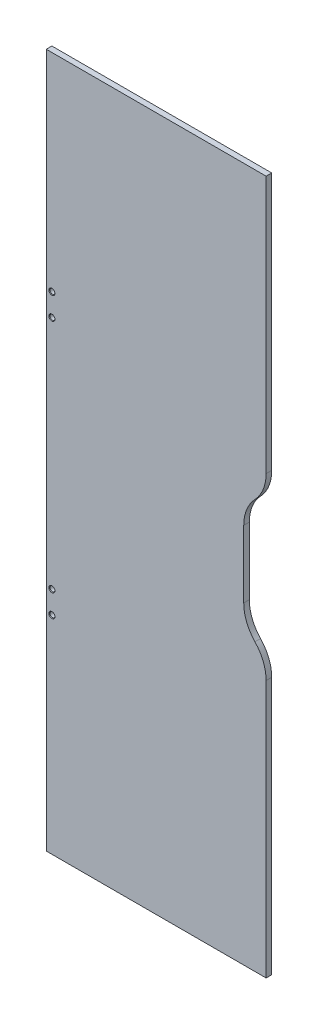
ISO-10303-21;
HEADER;
FILE_DESCRIPTION(('STEP AP214'),'2;1');
FILE_NAME('part.step','',(''),(''),'','','');
FILE_SCHEMA(('AUTOMOTIVE_DESIGN { 1 0 10303 214 1 1 1 1 }'));
ENDSEC;
DATA;
#1=APPLICATION_CONTEXT('core data for automotive mechanical design processes');
#2=APPLICATION_PROTOCOL_DEFINITION('international standard','automotive_design',2000,#1);
#3=PRODUCT_CONTEXT('',#1,'mechanical');
#4=PRODUCT('Part','Part','',(#3));
#5=PRODUCT_RELATED_PRODUCT_CATEGORY('part','',(#4));
#6=PRODUCT_DEFINITION_FORMATION('','',#4);
#7=PRODUCT_DEFINITION_CONTEXT('part definition',#1,'design');
#8=PRODUCT_DEFINITION('design','',#6,#7);
#9=PRODUCT_DEFINITION_SHAPE('','',#8);
#10=(LENGTH_UNIT() NAMED_UNIT(*) SI_UNIT(.MILLI.,.METRE.));
#11=(NAMED_UNIT(*) PLANE_ANGLE_UNIT() SI_UNIT($,.RADIAN.));
#12=(NAMED_UNIT(*) SI_UNIT($,.STERADIAN.) SOLID_ANGLE_UNIT());
#13=UNCERTAINTY_MEASURE_WITH_UNIT(LENGTH_MEASURE(1.E-05),#10,'distance_accuracy_value','');
#14=(GEOMETRIC_REPRESENTATION_CONTEXT(3) GLOBAL_UNCERTAINTY_ASSIGNED_CONTEXT((#13)) GLOBAL_UNIT_ASSIGNED_CONTEXT((#10,
#11,#12)) REPRESENTATION_CONTEXT('',''));
#15=CARTESIAN_POINT('',(0.,0.,0.));
#16=DIRECTION('',(0.,0.,1.));
#17=DIRECTION('',(1.,0.,0.));
#18=AXIS2_PLACEMENT_3D('',#15,#16,#17);
#19=CARTESIAN_POINT('',(292.1,0.,6.35));
#20=DIRECTION('',(-1.,0.,0.));
#21=DIRECTION('',(0.,0.,1.));
#22=AXIS2_PLACEMENT_3D('',#19,#20,#21);
#23=PLANE('',#22);
#24=DIRECTION('',(0.,0.,1.));
#25=VECTOR('',#24,1.);
#26=CARTESIAN_POINT('',(292.1,292.1,0.));
#27=LINE('',#26,#25);
#28=CARTESIAN_POINT('',(292.1,292.1,0.));
#29=VERTEX_POINT('',#28);
#30=CARTESIAN_POINT('',(292.1,292.1,6.35));
#31=VERTEX_POINT('',#30);
#32=EDGE_CURVE('E169',#29,#31,#27,.T.);
#33=ORIENTED_EDGE('',*,*,#32,.T.);
#34=DIRECTION('',(0.,1.,0.));
#35=VECTOR('',#34,1.);
#36=CARTESIAN_POINT('',(292.1,0.,6.35));
#37=LINE('',#36,#35);
#38=CARTESIAN_POINT('',(292.1,0.,6.35));
#39=VERTEX_POINT('',#38);
#40=EDGE_CURVE('E217',#39,#31,#37,.T.);
#41=ORIENTED_EDGE('',*,*,#40,.F.);
#42=DIRECTION('',(0.,0.,-1.));
#43=VECTOR('',#42,1.);
#44=CARTESIAN_POINT('',(292.1,0.,6.35));
#45=LINE('',#44,#43);
#46=CARTESIAN_POINT('',(292.1,0.,0.));
#47=VERTEX_POINT('',#46);
#48=EDGE_CURVE('E47',#39,#47,#45,.T.);
#49=ORIENTED_EDGE('',*,*,#48,.T.);
#50=DIRECTION('',(0.,1.,0.));
#51=VECTOR('',#50,1.);
#52=CARTESIAN_POINT('',(292.1,0.,0.));
#53=LINE('',#52,#51);
#54=EDGE_CURVE('E226',#47,#29,#53,.T.);
#55=ORIENTED_EDGE('',*,*,#54,.T.);
#56=EDGE_LOOP('',(#33,#41,#49,#55));
#57=FACE_BOUND('',#56,.T.);
#58=ADVANCED_FACE('F39',(#57),#23,.F.);
#59=CARTESIAN_POINT('',(42.799,0.,6.35));
#60=DIRECTION('',(1.,0.,0.));
#61=DIRECTION('',(0.,0.,-1.));
#62=AXIS2_PLACEMENT_3D('',#59,#60,#61);
#63=PLANE('',#62);
#64=DIRECTION('',(0.,-1.,0.));
#65=VECTOR('',#64,1.);
#66=CARTESIAN_POINT('',(42.799,0.,0.));
#67=LINE('',#66,#65);
#68=CARTESIAN_POINT('',(42.799,787.4,0.));
#69=VERTEX_POINT('',#68);
#70=CARTESIAN_POINT('',(42.799,0.,0.));
#71=VERTEX_POINT('',#70);
#72=EDGE_CURVE('E212',#69,#71,#67,.T.);
#73=ORIENTED_EDGE('',*,*,#72,.T.);
#74=DIRECTION('',(0.,0.,-1.));
#75=VECTOR('',#74,1.);
#76=CARTESIAN_POINT('',(42.799,0.,6.35));
#77=LINE('',#76,#75);
#78=CARTESIAN_POINT('',(42.799,0.,6.35));
#79=VERTEX_POINT('',#78);
#80=EDGE_CURVE('E11',#79,#71,#77,.T.);
#81=ORIENTED_EDGE('',*,*,#80,.F.);
#82=DIRECTION('',(0.,-1.,0.));
#83=VECTOR('',#82,1.);
#84=CARTESIAN_POINT('',(42.799,0.,6.35));
#85=LINE('',#84,#83);
#86=CARTESIAN_POINT('',(42.799,787.4,6.35));
#87=VERTEX_POINT('',#86);
#88=EDGE_CURVE('E213',#87,#79,#85,.T.);
#89=ORIENTED_EDGE('',*,*,#88,.F.);
#90=DIRECTION('',(0.,0.,-1.));
#91=VECTOR('',#90,1.);
#92=CARTESIAN_POINT('',(42.799,787.4,6.35));
#93=LINE('',#92,#91);
#94=EDGE_CURVE('E221',#87,#69,#93,.T.);
#95=ORIENTED_EDGE('',*,*,#94,.T.);
#96=EDGE_LOOP('',(#73,#81,#89,#95));
#97=FACE_BOUND('',#96,.T.);
#98=ADVANCED_FACE('F41',(#97),#63,.F.);
#99=CARTESIAN_POINT('',(42.799,0.,6.35));
#100=DIRECTION('',(0.,1.,0.));
#101=DIRECTION('',(0.,0.,1.));
#102=AXIS2_PLACEMENT_3D('',#99,#100,#101);
#103=PLANE('',#102);
#104=DIRECTION('',(1.,0.,0.));
#105=VECTOR('',#104,1.);
#106=CARTESIAN_POINT('',(42.799,0.,0.));
#107=LINE('',#106,#105);
#108=EDGE_CURVE('E224',#71,#47,#107,.T.);
#109=ORIENTED_EDGE('',*,*,#108,.T.);
#110=ORIENTED_EDGE('',*,*,#48,.F.);
#111=DIRECTION('',(1.,0.,0.));
#112=VECTOR('',#111,1.);
#113=CARTESIAN_POINT('',(42.799,0.,6.35));
#114=LINE('',#113,#112);
#115=EDGE_CURVE('E91',#79,#39,#114,.T.);
#116=ORIENTED_EDGE('',*,*,#115,.F.);
#117=ORIENTED_EDGE('',*,*,#80,.T.);
#118=EDGE_LOOP('',(#109,#110,#116,#117));
#119=FACE_BOUND('',#118,.T.);
#120=ADVANCED_FACE('F247',(#119),#103,.F.);
#121=CARTESIAN_POINT('',(292.1,495.3,6.35));
#122=VERTEX_POINT('',#121);
#123=CARTESIAN_POINT('',(292.1,787.4,6.35));
#124=VERTEX_POINT('',#123);
#125=EDGE_CURVE('E216',#122,#124,#37,.T.);
#126=ORIENTED_EDGE('',*,*,#125,.F.);
#127=DIRECTION('',(0.,0.,1.));
#128=VECTOR('',#127,1.);
#129=CARTESIAN_POINT('',(292.1,495.3,0.));
#130=LINE('',#129,#128);
#131=CARTESIAN_POINT('',(292.1,495.3,0.));
#132=VERTEX_POINT('',#131);
#133=EDGE_CURVE('E166',#132,#122,#130,.T.);
#134=ORIENTED_EDGE('',*,*,#133,.F.);
#135=CARTESIAN_POINT('',(292.1,787.4,0.));
#136=VERTEX_POINT('',#135);
#137=EDGE_CURVE('E146',#132,#136,#53,.T.);
#138=ORIENTED_EDGE('',*,*,#137,.T.);
#139=DIRECTION('',(0.,0.,-1.));
#140=VECTOR('',#139,1.);
#141=CARTESIAN_POINT('',(292.1,787.4,6.35));
#142=LINE('',#141,#140);
#143=EDGE_CURVE('E231',#124,#136,#142,.T.);
#144=ORIENTED_EDGE('',*,*,#143,.F.);
#145=EDGE_LOOP('',(#126,#134,#138,#144));
#146=FACE_BOUND('',#145,.T.);
#147=ADVANCED_FACE('F249',(#146),#23,.F.);
#148=CARTESIAN_POINT('',(42.799,787.4,6.35));
#149=DIRECTION('',(0.,-1.,0.));
#150=DIRECTION('',(0.,0.,-1.));
#151=AXIS2_PLACEMENT_3D('',#148,#149,#150);
#152=PLANE('',#151);
#153=DIRECTION('',(-1.,0.,0.));
#154=VECTOR('',#153,1.);
#155=CARTESIAN_POINT('',(42.799,787.4,0.));
#156=LINE('',#155,#154);
#157=EDGE_CURVE('E84',#136,#69,#156,.T.);
#158=ORIENTED_EDGE('',*,*,#157,.T.);
#159=ORIENTED_EDGE('',*,*,#94,.F.);
#160=DIRECTION('',(-1.,0.,0.));
#161=VECTOR('',#160,1.);
#162=CARTESIAN_POINT('',(42.799,787.4,6.35));
#163=LINE('',#162,#161);
#164=EDGE_CURVE('E63',#124,#87,#163,.T.);
#165=ORIENTED_EDGE('',*,*,#164,.F.);
#166=ORIENTED_EDGE('',*,*,#143,.T.);
#167=EDGE_LOOP('',(#158,#159,#165,#166));
#168=FACE_BOUND('',#167,.T.);
#169=ADVANCED_FACE('F255',(#168),#152,.F.);
#170=CARTESIAN_POINT('',(0.,0.,6.35));
#171=DIRECTION('',(0.,0.,-1.));
#172=DIRECTION('',(-1.,0.,0.));
#173=AXIS2_PLACEMENT_3D('',#170,#171,#172);
#174=PLANE('',#173);
#175=CARTESIAN_POINT('',(49.149,552.45,6.35));
#176=DIRECTION('',(0.,0.,1.));
#177=DIRECTION('',(1.,0.,0.));
#178=AXIS2_PLACEMENT_3D('',#175,#176,#177);
#179=CIRCLE('',#178,3.4417);
#180=CARTESIAN_POINT('',(52.5907,552.45,6.35));
#181=VERTEX_POINT('',#180);
#182=EDGE_CURVE('E168',#181,#181,#179,.T.);
#183=ORIENTED_EDGE('',*,*,#182,.F.);
#184=EDGE_LOOP('',(#183));
#185=FACE_BOUND('',#184,.T.);
#186=CARTESIAN_POINT('',(49.149,527.05,6.35));
#187=DIRECTION('',(0.,0.,1.));
#188=DIRECTION('',(1.,0.,0.));
#189=AXIS2_PLACEMENT_3D('',#186,#187,#188);
#190=CIRCLE('',#189,3.4417);
#191=CARTESIAN_POINT('',(52.5907,527.05,6.35));
#192=VERTEX_POINT('',#191);
#193=EDGE_CURVE('E185',#192,#192,#190,.T.);
#194=ORIENTED_EDGE('',*,*,#193,.F.);
#195=EDGE_LOOP('',(#194));
#196=FACE_BOUND('',#195,.T.);
#197=CARTESIAN_POINT('',(49.149,260.35,6.35));
#198=DIRECTION('',(0.,0.,1.));
#199=DIRECTION('',(1.,0.,0.));
#200=AXIS2_PLACEMENT_3D('',#197,#198,#199);
#201=CIRCLE('',#200,3.4417);
#202=CARTESIAN_POINT('',(52.5907,260.35,6.35));
#203=VERTEX_POINT('',#202);
#204=EDGE_CURVE('E194',#203,#203,#201,.T.);
#205=ORIENTED_EDGE('',*,*,#204,.F.);
#206=EDGE_LOOP('',(#205));
#207=FACE_BOUND('',#206,.T.);
#208=CARTESIAN_POINT('',(49.149,234.95,6.35));
#209=DIRECTION('',(0.,0.,1.));
#210=DIRECTION('',(1.,0.,0.));
#211=AXIS2_PLACEMENT_3D('',#208,#209,#210);
#212=CIRCLE('',#211,3.4417);
#213=CARTESIAN_POINT('',(52.5907,234.95,6.35));
#214=VERTEX_POINT('',#213);
#215=EDGE_CURVE('E203',#214,#214,#212,.T.);
#216=ORIENTED_EDGE('',*,*,#215,.F.);
#217=EDGE_LOOP('',(#216));
#218=FACE_BOUND('',#217,.T.);
#219=CARTESIAN_POINT('',(312.7375,431.8,6.35));
#220=DIRECTION('',(0.,0.,1.));
#221=DIRECTION('',(-1.,0.,0.));
#222=AXIS2_PLACEMENT_3D('',#219,#220,#221);
#223=CIRCLE('',#222,46.0375000000001);
#224=CARTESIAN_POINT('',(279.4,463.55,6.35));
#225=VERTEX_POINT('',#224);
#226=CARTESIAN_POINT('',(266.7,431.8,6.35));
#227=VERTEX_POINT('',#226);
#228=EDGE_CURVE('E159',#225,#227,#223,.T.);
#229=ORIENTED_EDGE('',*,*,#228,.F.);
#230=CARTESIAN_POINT('',(246.0625,495.3,6.35));
#231=DIRECTION('',(0.,0.,-1.));
#232=DIRECTION('',(1.,0.,0.));
#233=AXIS2_PLACEMENT_3D('',#230,#231,#232);
#234=CIRCLE('',#233,46.0375000000001);
#235=EDGE_CURVE('E131',#122,#225,#234,.T.);
#236=ORIENTED_EDGE('',*,*,#235,.F.);
#237=ORIENTED_EDGE('',*,*,#125,.T.);
#238=ORIENTED_EDGE('',*,*,#164,.T.);
#239=ORIENTED_EDGE('',*,*,#88,.T.);
#240=ORIENTED_EDGE('',*,*,#115,.T.);
#241=ORIENTED_EDGE('',*,*,#40,.T.);
#242=CARTESIAN_POINT('',(246.0625,292.1,6.35));
#243=DIRECTION('',(0.,0.,-1.));
#244=DIRECTION('',(1.,0.,0.));
#245=AXIS2_PLACEMENT_3D('',#242,#243,#244);
#246=CIRCLE('',#245,46.0375000000001);
#247=CARTESIAN_POINT('',(279.4,323.85,6.35));
#248=VERTEX_POINT('',#247);
#249=EDGE_CURVE('E147',#248,#31,#246,.T.);
#250=ORIENTED_EDGE('',*,*,#249,.F.);
#251=CARTESIAN_POINT('',(312.7375,355.6,6.35));
#252=DIRECTION('',(0.,0.,1.));
#253=DIRECTION('',(-1.,0.,0.));
#254=AXIS2_PLACEMENT_3D('',#251,#252,#253);
#255=CIRCLE('',#254,46.0375);
#256=CARTESIAN_POINT('',(266.7,355.6,6.35));
#257=VERTEX_POINT('',#256);
#258=EDGE_CURVE('E149',#257,#248,#255,.T.);
#259=ORIENTED_EDGE('',*,*,#258,.F.);
#260=DIRECTION('',(0.,-1.,0.));
#261=VECTOR('',#260,1.);
#262=CARTESIAN_POINT('',(266.7,355.6,6.35));
#263=LINE('',#262,#261);
#264=EDGE_CURVE('E161',#227,#257,#263,.T.);
#265=ORIENTED_EDGE('',*,*,#264,.F.);
#266=EDGE_LOOP('',(#229,#236,#237,#238,#239,#240,#241,#250,#259,#265));
#267=FACE_BOUND('',#266,.T.);
#268=ADVANCED_FACE('F242',(#185,#196,#207,#218,#267),#174,.F.);
#269=CARTESIAN_POINT('',(0.,0.,0.));
#270=DIRECTION('',(0.,0.,-1.));
#271=DIRECTION('',(-1.,0.,0.));
#272=AXIS2_PLACEMENT_3D('',#269,#270,#271);
#273=PLANE('',#272);
#274=CARTESIAN_POINT('',(246.0625,495.3,0.));
#275=DIRECTION('',(0.,0.,-1.));
#276=DIRECTION('',(1.,0.,0.));
#277=AXIS2_PLACEMENT_3D('',#274,#275,#276);
#278=CIRCLE('',#277,46.0375000000001);
#279=CARTESIAN_POINT('',(279.4,463.55,0.));
#280=VERTEX_POINT('',#279);
#281=EDGE_CURVE('E128',#132,#280,#278,.T.);
#282=ORIENTED_EDGE('',*,*,#281,.T.);
#283=CARTESIAN_POINT('',(312.7375,431.8,0.));
#284=DIRECTION('',(0.,0.,1.));
#285=DIRECTION('',(-1.,0.,0.));
#286=AXIS2_PLACEMENT_3D('',#283,#284,#285);
#287=CIRCLE('',#286,46.0375000000001);
#288=CARTESIAN_POINT('',(266.7,431.8,0.));
#289=VERTEX_POINT('',#288);
#290=EDGE_CURVE('E139',#280,#289,#287,.T.);
#291=ORIENTED_EDGE('',*,*,#290,.T.);
#292=DIRECTION('',(0.,-1.,0.));
#293=VECTOR('',#292,1.);
#294=CARTESIAN_POINT('',(266.7,355.6,0.));
#295=LINE('',#294,#293);
#296=CARTESIAN_POINT('',(266.7,355.6,0.));
#297=VERTEX_POINT('',#296);
#298=EDGE_CURVE('E54',#289,#297,#295,.T.);
#299=ORIENTED_EDGE('',*,*,#298,.T.);
#300=CARTESIAN_POINT('',(312.7375,355.6,0.));
#301=DIRECTION('',(0.,0.,1.));
#302=DIRECTION('',(-1.,0.,0.));
#303=AXIS2_PLACEMENT_3D('',#300,#301,#302);
#304=CIRCLE('',#303,46.0375);
#305=CARTESIAN_POINT('',(279.4,323.85,0.));
#306=VERTEX_POINT('',#305);
#307=EDGE_CURVE('E153',#297,#306,#304,.T.);
#308=ORIENTED_EDGE('',*,*,#307,.T.);
#309=CARTESIAN_POINT('',(246.0625,292.1,0.));
#310=DIRECTION('',(0.,0.,-1.));
#311=DIRECTION('',(1.,0.,0.));
#312=AXIS2_PLACEMENT_3D('',#309,#310,#311);
#313=CIRCLE('',#312,46.0375000000001);
#314=EDGE_CURVE('E136',#306,#29,#313,.T.);
#315=ORIENTED_EDGE('',*,*,#314,.T.);
#316=ORIENTED_EDGE('',*,*,#54,.F.);
#317=ORIENTED_EDGE('',*,*,#108,.F.);
#318=ORIENTED_EDGE('',*,*,#72,.F.);
#319=ORIENTED_EDGE('',*,*,#157,.F.);
#320=ORIENTED_EDGE('',*,*,#137,.F.);
#321=EDGE_LOOP('',(#282,#291,#299,#308,#315,#316,#317,#318,#319,#320));
#322=FACE_BOUND('',#321,.T.);
#323=CARTESIAN_POINT('',(49.149,552.45,0.));
#324=DIRECTION('',(0.,0.,1.));
#325=DIRECTION('',(1.,0.,0.));
#326=AXIS2_PLACEMENT_3D('',#323,#324,#325);
#327=CIRCLE('',#326,2.8067);
#328=CARTESIAN_POINT('',(51.9557,552.45,0.));
#329=VERTEX_POINT('',#328);
#330=EDGE_CURVE('E182',#329,#329,#327,.T.);
#331=ORIENTED_EDGE('',*,*,#330,.T.);
#332=EDGE_LOOP('',(#331));
#333=FACE_BOUND('',#332,.T.);
#334=CARTESIAN_POINT('',(49.149,527.05,0.));
#335=DIRECTION('',(0.,0.,1.));
#336=DIRECTION('',(1.,0.,0.));
#337=AXIS2_PLACEMENT_3D('',#334,#335,#336);
#338=CIRCLE('',#337,2.8067);
#339=CARTESIAN_POINT('',(51.9557,527.05,0.));
#340=VERTEX_POINT('',#339);
#341=EDGE_CURVE('E191',#340,#340,#338,.T.);
#342=ORIENTED_EDGE('',*,*,#341,.T.);
#343=EDGE_LOOP('',(#342));
#344=FACE_BOUND('',#343,.T.);
#345=CARTESIAN_POINT('',(49.149,260.35,0.));
#346=DIRECTION('',(0.,0.,1.));
#347=DIRECTION('',(1.,0.,0.));
#348=AXIS2_PLACEMENT_3D('',#345,#346,#347);
#349=CIRCLE('',#348,2.8067);
#350=CARTESIAN_POINT('',(51.9557,260.35,0.));
#351=VERTEX_POINT('',#350);
#352=EDGE_CURVE('E200',#351,#351,#349,.T.);
#353=ORIENTED_EDGE('',*,*,#352,.T.);
#354=EDGE_LOOP('',(#353));
#355=FACE_BOUND('',#354,.T.);
#356=CARTESIAN_POINT('',(49.149,234.95,0.));
#357=DIRECTION('',(0.,0.,1.));
#358=DIRECTION('',(1.,0.,0.));
#359=AXIS2_PLACEMENT_3D('',#356,#357,#358);
#360=CIRCLE('',#359,2.8067);
#361=CARTESIAN_POINT('',(51.9557,234.95,0.));
#362=VERTEX_POINT('',#361);
#363=EDGE_CURVE('E209',#362,#362,#360,.T.);
#364=ORIENTED_EDGE('',*,*,#363,.T.);
#365=EDGE_LOOP('',(#364));
#366=FACE_BOUND('',#365,.T.);
#367=ADVANCED_FACE('F144',(#322,#333,#344,#355,#366),#273,.T.);
#368=CARTESIAN_POINT('',(49.149,234.95,6.35));
#369=DIRECTION('',(0.,0.,1.));
#370=DIRECTION('',(1.,0.,0.));
#371=AXIS2_PLACEMENT_3D('',#368,#369,#370);
#372=CYLINDRICAL_SURFACE('',#371,2.8067);
#373=ORIENTED_EDGE('',*,*,#363,.F.);
#374=EDGE_LOOP('',(#373));
#375=FACE_BOUND('',#374,.T.);
#376=CARTESIAN_POINT('',(49.149,234.95,5.71499999999999));
#377=DIRECTION('',(0.,0.,1.));
#378=DIRECTION('',(1.,0.,0.));
#379=AXIS2_PLACEMENT_3D('',#376,#377,#378);
#380=CIRCLE('',#379,2.80669999999999);
#381=CARTESIAN_POINT('',(51.9557,234.95,5.71499999999999));
#382=VERTEX_POINT('',#381);
#383=EDGE_CURVE('E206',#382,#382,#380,.T.);
#384=ORIENTED_EDGE('',*,*,#383,.T.);
#385=EDGE_LOOP('',(#384));
#386=FACE_BOUND('',#385,.T.);
#387=ADVANCED_FACE('F267',(#375,#386),#372,.F.);
#388=CARTESIAN_POINT('',(49.149,234.95,6.35));
#389=DIRECTION('',(0.,0.,1.));
#390=DIRECTION('',(1.,0.,0.));
#391=AXIS2_PLACEMENT_3D('',#388,#389,#390);
#392=CONICAL_SURFACE('',#391,3.4417,0.785398163397447);
#393=ORIENTED_EDGE('',*,*,#383,.F.);
#394=EDGE_LOOP('',(#393));
#395=FACE_BOUND('',#394,.T.);
#396=ORIENTED_EDGE('',*,*,#215,.T.);
#397=EDGE_LOOP('',(#396));
#398=FACE_BOUND('',#397,.T.);
#399=ADVANCED_FACE('F273',(#395,#398),#392,.F.);
#400=CARTESIAN_POINT('',(49.149,260.35,6.35));
#401=DIRECTION('',(0.,0.,1.));
#402=DIRECTION('',(1.,0.,0.));
#403=AXIS2_PLACEMENT_3D('',#400,#401,#402);
#404=CYLINDRICAL_SURFACE('',#403,2.8067);
#405=ORIENTED_EDGE('',*,*,#352,.F.);
#406=EDGE_LOOP('',(#405));
#407=FACE_BOUND('',#406,.T.);
#408=CARTESIAN_POINT('',(49.149,260.35,5.71499999999999));
#409=DIRECTION('',(0.,0.,1.));
#410=DIRECTION('',(1.,0.,0.));
#411=AXIS2_PLACEMENT_3D('',#408,#409,#410);
#412=CIRCLE('',#411,2.80669999999999);
#413=CARTESIAN_POINT('',(51.9557,260.35,5.71499999999999));
#414=VERTEX_POINT('',#413);
#415=EDGE_CURVE('E197',#414,#414,#412,.T.);
#416=ORIENTED_EDGE('',*,*,#415,.T.);
#417=EDGE_LOOP('',(#416));
#418=FACE_BOUND('',#417,.T.);
#419=ADVANCED_FACE('F277',(#407,#418),#404,.F.);
#420=CARTESIAN_POINT('',(49.149,260.35,6.35));
#421=DIRECTION('',(0.,0.,1.));
#422=DIRECTION('',(1.,0.,0.));
#423=AXIS2_PLACEMENT_3D('',#420,#421,#422);
#424=CONICAL_SURFACE('',#423,3.4417,0.785398163397447);
#425=ORIENTED_EDGE('',*,*,#415,.F.);
#426=EDGE_LOOP('',(#425));
#427=FACE_BOUND('',#426,.T.);
#428=ORIENTED_EDGE('',*,*,#204,.T.);
#429=EDGE_LOOP('',(#428));
#430=FACE_BOUND('',#429,.T.);
#431=ADVANCED_FACE('F281',(#427,#430),#424,.F.);
#432=CARTESIAN_POINT('',(49.149,527.05,6.35));
#433=DIRECTION('',(0.,0.,1.));
#434=DIRECTION('',(1.,0.,0.));
#435=AXIS2_PLACEMENT_3D('',#432,#433,#434);
#436=CYLINDRICAL_SURFACE('',#435,2.8067);
#437=ORIENTED_EDGE('',*,*,#341,.F.);
#438=EDGE_LOOP('',(#437));
#439=FACE_BOUND('',#438,.T.);
#440=CARTESIAN_POINT('',(49.149,527.05,5.71499999999999));
#441=DIRECTION('',(0.,0.,1.));
#442=DIRECTION('',(1.,0.,0.));
#443=AXIS2_PLACEMENT_3D('',#440,#441,#442);
#444=CIRCLE('',#443,2.80669999999999);
#445=CARTESIAN_POINT('',(51.9557,527.05,5.71499999999999));
#446=VERTEX_POINT('',#445);
#447=EDGE_CURVE('E188',#446,#446,#444,.T.);
#448=ORIENTED_EDGE('',*,*,#447,.T.);
#449=EDGE_LOOP('',(#448));
#450=FACE_BOUND('',#449,.T.);
#451=ADVANCED_FACE('F285',(#439,#450),#436,.F.);
#452=CARTESIAN_POINT('',(49.149,527.05,6.35));
#453=DIRECTION('',(0.,0.,1.));
#454=DIRECTION('',(1.,0.,0.));
#455=AXIS2_PLACEMENT_3D('',#452,#453,#454);
#456=CONICAL_SURFACE('',#455,3.4417,0.785398163397447);
#457=ORIENTED_EDGE('',*,*,#447,.F.);
#458=EDGE_LOOP('',(#457));
#459=FACE_BOUND('',#458,.T.);
#460=ORIENTED_EDGE('',*,*,#193,.T.);
#461=EDGE_LOOP('',(#460));
#462=FACE_BOUND('',#461,.T.);
#463=ADVANCED_FACE('F289',(#459,#462),#456,.F.);
#464=CARTESIAN_POINT('',(49.149,552.45,6.35));
#465=DIRECTION('',(0.,0.,1.));
#466=DIRECTION('',(1.,0.,0.));
#467=AXIS2_PLACEMENT_3D('',#464,#465,#466);
#468=CYLINDRICAL_SURFACE('',#467,2.8067);
#469=ORIENTED_EDGE('',*,*,#330,.F.);
#470=EDGE_LOOP('',(#469));
#471=FACE_BOUND('',#470,.T.);
#472=CARTESIAN_POINT('',(49.149,552.45,5.71499999999999));
#473=DIRECTION('',(0.,0.,1.));
#474=DIRECTION('',(1.,0.,0.));
#475=AXIS2_PLACEMENT_3D('',#472,#473,#474);
#476=CIRCLE('',#475,2.80669999999999);
#477=CARTESIAN_POINT('',(51.9557,552.45,5.71499999999999));
#478=VERTEX_POINT('',#477);
#479=EDGE_CURVE('E179',#478,#478,#476,.T.);
#480=ORIENTED_EDGE('',*,*,#479,.T.);
#481=EDGE_LOOP('',(#480));
#482=FACE_BOUND('',#481,.T.);
#483=ADVANCED_FACE('F293',(#471,#482),#468,.F.);
#484=CARTESIAN_POINT('',(49.149,552.45,6.35));
#485=DIRECTION('',(0.,0.,1.));
#486=DIRECTION('',(1.,0.,0.));
#487=AXIS2_PLACEMENT_3D('',#484,#485,#486);
#488=CONICAL_SURFACE('',#487,3.4417,0.785398163397447);
#489=ORIENTED_EDGE('',*,*,#479,.F.);
#490=EDGE_LOOP('',(#489));
#491=FACE_BOUND('',#490,.T.);
#492=ORIENTED_EDGE('',*,*,#182,.T.);
#493=EDGE_LOOP('',(#492));
#494=FACE_BOUND('',#493,.T.);
#495=ADVANCED_FACE('F297',(#491,#494),#488,.F.);
#496=CARTESIAN_POINT('',(246.0625,495.3,0.));
#497=DIRECTION('',(0.,0.,1.));
#498=DIRECTION('',(1.,0.,0.));
#499=AXIS2_PLACEMENT_3D('',#496,#497,#498);
#500=CYLINDRICAL_SURFACE('',#499,46.0375000000001);
#501=ORIENTED_EDGE('',*,*,#235,.T.);
#502=DIRECTION('',(0.,0.,1.));
#503=VECTOR('',#502,1.);
#504=CARTESIAN_POINT('',(279.4,463.55,0.));
#505=LINE('',#504,#503);
#506=EDGE_CURVE('E124',#280,#225,#505,.T.);
#507=ORIENTED_EDGE('',*,*,#506,.F.);
#508=ORIENTED_EDGE('',*,*,#281,.F.);
#509=ORIENTED_EDGE('',*,*,#133,.T.);
#510=EDGE_LOOP('',(#501,#507,#508,#509));
#511=FACE_BOUND('',#510,.T.);
#512=ADVANCED_FACE('F126',(#511),#500,.T.);
#513=CARTESIAN_POINT('',(246.0625,292.1,0.));
#514=DIRECTION('',(0.,0.,1.));
#515=DIRECTION('',(1.,0.,0.));
#516=AXIS2_PLACEMENT_3D('',#513,#514,#515);
#517=CYLINDRICAL_SURFACE('',#516,46.0375000000001);
#518=ORIENTED_EDGE('',*,*,#249,.T.);
#519=ORIENTED_EDGE('',*,*,#32,.F.);
#520=ORIENTED_EDGE('',*,*,#314,.F.);
#521=DIRECTION('',(0.,0.,1.));
#522=VECTOR('',#521,1.);
#523=CARTESIAN_POINT('',(279.4,323.85,0.));
#524=LINE('',#523,#522);
#525=EDGE_CURVE('E172',#306,#248,#524,.T.);
#526=ORIENTED_EDGE('',*,*,#525,.T.);
#527=EDGE_LOOP('',(#518,#519,#520,#526));
#528=FACE_BOUND('',#527,.T.);
#529=ADVANCED_FACE('F240',(#528),#517,.T.);
#530=CARTESIAN_POINT('',(312.7375,355.6,0.));
#531=DIRECTION('',(0.,0.,1.));
#532=DIRECTION('',(1.,0.,0.));
#533=AXIS2_PLACEMENT_3D('',#530,#531,#532);
#534=CYLINDRICAL_SURFACE('',#533,46.0375);
#535=ORIENTED_EDGE('',*,*,#258,.T.);
#536=ORIENTED_EDGE('',*,*,#525,.F.);
#537=ORIENTED_EDGE('',*,*,#307,.F.);
#538=DIRECTION('',(0.,0.,1.));
#539=VECTOR('',#538,1.);
#540=CARTESIAN_POINT('',(266.7,355.6,0.));
#541=LINE('',#540,#539);
#542=EDGE_CURVE('E174',#297,#257,#541,.T.);
#543=ORIENTED_EDGE('',*,*,#542,.T.);
#544=EDGE_LOOP('',(#535,#536,#537,#543));
#545=FACE_BOUND('',#544,.T.);
#546=ADVANCED_FACE('F309',(#545),#534,.F.);
#547=CARTESIAN_POINT('',(266.7,355.6,0.));
#548=DIRECTION('',(-1.,0.,0.));
#549=DIRECTION('',(0.,0.,1.));
#550=AXIS2_PLACEMENT_3D('',#547,#548,#549);
#551=PLANE('',#550);
#552=ORIENTED_EDGE('',*,*,#264,.T.);
#553=ORIENTED_EDGE('',*,*,#542,.F.);
#554=ORIENTED_EDGE('',*,*,#298,.F.);
#555=DIRECTION('',(0.,0.,1.));
#556=VECTOR('',#555,1.);
#557=CARTESIAN_POINT('',(266.7,431.8,0.));
#558=LINE('',#557,#556);
#559=EDGE_CURVE('E135',#289,#227,#558,.T.);
#560=ORIENTED_EDGE('',*,*,#559,.T.);
#561=EDGE_LOOP('',(#552,#553,#554,#560));
#562=FACE_BOUND('',#561,.T.);
#563=ADVANCED_FACE('F306',(#562),#551,.F.);
#564=CARTESIAN_POINT('',(312.7375,431.8,0.));
#565=DIRECTION('',(0.,0.,1.));
#566=DIRECTION('',(1.,0.,0.));
#567=AXIS2_PLACEMENT_3D('',#564,#565,#566);
#568=CYLINDRICAL_SURFACE('',#567,46.0375000000001);
#569=ORIENTED_EDGE('',*,*,#228,.T.);
#570=ORIENTED_EDGE('',*,*,#559,.F.);
#571=ORIENTED_EDGE('',*,*,#290,.F.);
#572=ORIENTED_EDGE('',*,*,#506,.T.);
#573=EDGE_LOOP('',(#569,#570,#571,#572));
#574=FACE_BOUND('',#573,.T.);
#575=ADVANCED_FACE('F140',(#574),#568,.F.);
#576=CLOSED_SHELL('',(#58,#98,#120,#147,#169,#268,#367,#387,#399,#419,#431,#451,#463,#483,#495,
#512,#529,#546,#563,#575));
#577=MANIFOLD_SOLID_BREP('B2',#576);
#578=ADVANCED_BREP_SHAPE_REPRESENTATION('',(#18,#577),#14);
#579=SHAPE_DEFINITION_REPRESENTATION(#9,#578);
ENDSEC;
END-ISO-10303-21;
